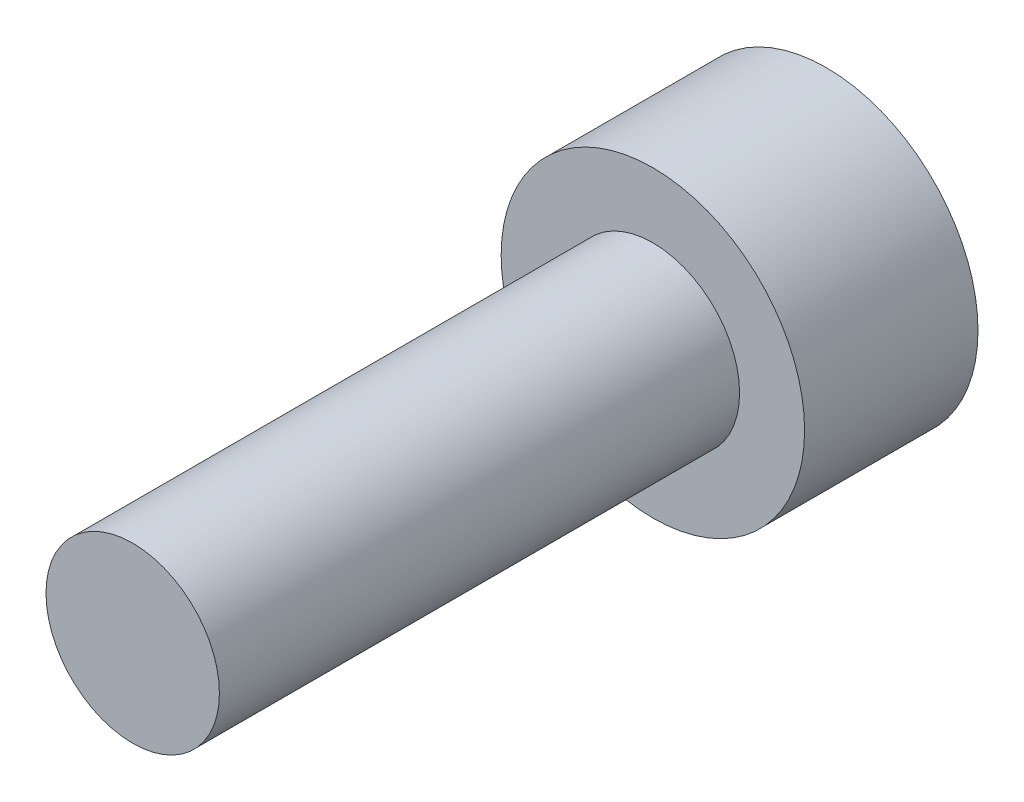
ISO-10303-21;
HEADER;
FILE_DESCRIPTION(('STEP AP214'),'2;1');
FILE_NAME('part.step','',(''),(''),'','','');
FILE_SCHEMA(('AUTOMOTIVE_DESIGN { 1 0 10303 214 1 1 1 1 }'));
ENDSEC;
DATA;
#1=APPLICATION_CONTEXT('core data for automotive mechanical design processes');
#2=APPLICATION_PROTOCOL_DEFINITION('international standard','automotive_design',2000,#1);
#3=PRODUCT_CONTEXT('',#1,'mechanical');
#4=PRODUCT('Part','Part','',(#3));
#5=PRODUCT_RELATED_PRODUCT_CATEGORY('part','',(#4));
#6=PRODUCT_DEFINITION_FORMATION('','',#4);
#7=PRODUCT_DEFINITION_CONTEXT('part definition',#1,'design');
#8=PRODUCT_DEFINITION('design','',#6,#7);
#9=PRODUCT_DEFINITION_SHAPE('','',#8);
#10=(LENGTH_UNIT() NAMED_UNIT(*) SI_UNIT(.MILLI.,.METRE.));
#11=(NAMED_UNIT(*) PLANE_ANGLE_UNIT() SI_UNIT($,.RADIAN.));
#12=(NAMED_UNIT(*) SI_UNIT($,.STERADIAN.) SOLID_ANGLE_UNIT());
#13=UNCERTAINTY_MEASURE_WITH_UNIT(LENGTH_MEASURE(1.E-05),#10,'distance_accuracy_value','');
#14=(GEOMETRIC_REPRESENTATION_CONTEXT(3) GLOBAL_UNCERTAINTY_ASSIGNED_CONTEXT((#13)) GLOBAL_UNIT_ASSIGNED_CONTEXT((#10,
#11,#12)) REPRESENTATION_CONTEXT('',''));
#15=CARTESIAN_POINT('',(0.,0.,0.));
#16=DIRECTION('',(0.,0.,1.));
#17=DIRECTION('',(1.,0.,0.));
#18=AXIS2_PLACEMENT_3D('',#15,#16,#17);
#19=CARTESIAN_POINT('',(0.,0.,0.));
#20=DIRECTION('',(0.,0.,-1.));
#21=DIRECTION('',(-1.,0.,0.));
#22=AXIS2_PLACEMENT_3D('',#19,#20,#21);
#23=CYLINDRICAL_SURFACE('',#22,3.5);
#24=CARTESIAN_POINT('',(0.,0.,0.));
#25=DIRECTION('',(0.,0.,1.));
#26=DIRECTION('',(1.,0.,0.));
#27=AXIS2_PLACEMENT_3D('',#24,#25,#26);
#28=CIRCLE('',#27,3.5);
#29=CARTESIAN_POINT('',(3.5,0.,0.));
#30=VERTEX_POINT('',#29);
#31=EDGE_CURVE('E42',#30,#30,#28,.T.);
#32=ORIENTED_EDGE('',*,*,#31,.F.);
#33=EDGE_LOOP('',(#32));
#34=FACE_BOUND('',#33,.T.);
#35=CARTESIAN_POINT('',(0.,0.,-4.));
#36=DIRECTION('',(0.,0.,1.));
#37=DIRECTION('',(1.,0.,0.));
#38=AXIS2_PLACEMENT_3D('',#35,#36,#37);
#39=CIRCLE('',#38,3.5);
#40=CARTESIAN_POINT('',(3.5,0.,-4.));
#41=VERTEX_POINT('',#40);
#42=EDGE_CURVE('E37',#41,#41,#39,.T.);
#43=ORIENTED_EDGE('',*,*,#42,.T.);
#44=EDGE_LOOP('',(#43));
#45=FACE_BOUND('',#44,.T.);
#46=ADVANCED_FACE('F40',(#34,#45),#23,.T.);
#47=CARTESIAN_POINT('',(0.,0.,0.));
#48=DIRECTION('',(0.,0.,1.));
#49=DIRECTION('',(1.,0.,0.));
#50=AXIS2_PLACEMENT_3D('',#47,#48,#49);
#51=PLANE('',#50);
#52=CARTESIAN_POINT('',(0.,0.,0.));
#53=DIRECTION('',(0.,0.,1.));
#54=DIRECTION('',(1.,0.,0.));
#55=AXIS2_PLACEMENT_3D('',#52,#53,#54);
#56=CIRCLE('',#55,2.);
#57=CARTESIAN_POINT('',(2.,0.,0.));
#58=VERTEX_POINT('',#57);
#59=EDGE_CURVE('E10',#58,#58,#56,.T.);
#60=ORIENTED_EDGE('',*,*,#59,.F.);
#61=EDGE_LOOP('',(#60));
#62=FACE_BOUND('',#61,.T.);
#63=ORIENTED_EDGE('',*,*,#31,.T.);
#64=EDGE_LOOP('',(#63));
#65=FACE_BOUND('',#64,.T.);
#66=ADVANCED_FACE('F63',(#62,#65),#51,.T.);
#67=CARTESIAN_POINT('',(0.,0.,-4.));
#68=DIRECTION('',(0.,0.,1.));
#69=DIRECTION('',(1.,0.,0.));
#70=AXIS2_PLACEMENT_3D('',#67,#68,#69);
#71=PLANE('',#70);
#72=ORIENTED_EDGE('',*,*,#42,.F.);
#73=EDGE_LOOP('',(#72));
#74=FACE_BOUND('',#73,.T.);
#75=ADVANCED_FACE('F59',(#74),#71,.F.);
#76=CARTESIAN_POINT('',(0.,0.,12.));
#77=DIRECTION('',(0.,0.,-1.));
#78=DIRECTION('',(-1.,0.,0.));
#79=AXIS2_PLACEMENT_3D('',#76,#77,#78);
#80=CYLINDRICAL_SURFACE('',#79,2.);
#81=CARTESIAN_POINT('',(0.,0.,12.));
#82=DIRECTION('',(0.,0.,1.));
#83=DIRECTION('',(1.,0.,0.));
#84=AXIS2_PLACEMENT_3D('',#81,#82,#83);
#85=CIRCLE('',#84,2.);
#86=CARTESIAN_POINT('',(2.,0.,12.));
#87=VERTEX_POINT('',#86);
#88=EDGE_CURVE('E49',#87,#87,#85,.T.);
#89=ORIENTED_EDGE('',*,*,#88,.F.);
#90=EDGE_LOOP('',(#89));
#91=FACE_BOUND('',#90,.T.);
#92=ORIENTED_EDGE('',*,*,#59,.T.);
#93=EDGE_LOOP('',(#92));
#94=FACE_BOUND('',#93,.T.);
#95=ADVANCED_FACE('F58',(#91,#94),#80,.T.);
#96=CARTESIAN_POINT('',(0.,0.,12.));
#97=DIRECTION('',(0.,0.,1.));
#98=DIRECTION('',(1.,0.,0.));
#99=AXIS2_PLACEMENT_3D('',#96,#97,#98);
#100=PLANE('',#99);
#101=ORIENTED_EDGE('',*,*,#88,.T.);
#102=EDGE_LOOP('',(#101));
#103=FACE_BOUND('',#102,.T.);
#104=ADVANCED_FACE('F70',(#103),#100,.T.);
#105=CLOSED_SHELL('',(#46,#66,#75,#95,#104));
#106=MANIFOLD_SOLID_BREP('B2',#105);
#107=ADVANCED_BREP_SHAPE_REPRESENTATION('',(#18,#106),#14);
#108=SHAPE_DEFINITION_REPRESENTATION(#9,#107);
ENDSEC;
END-ISO-10303-21;
